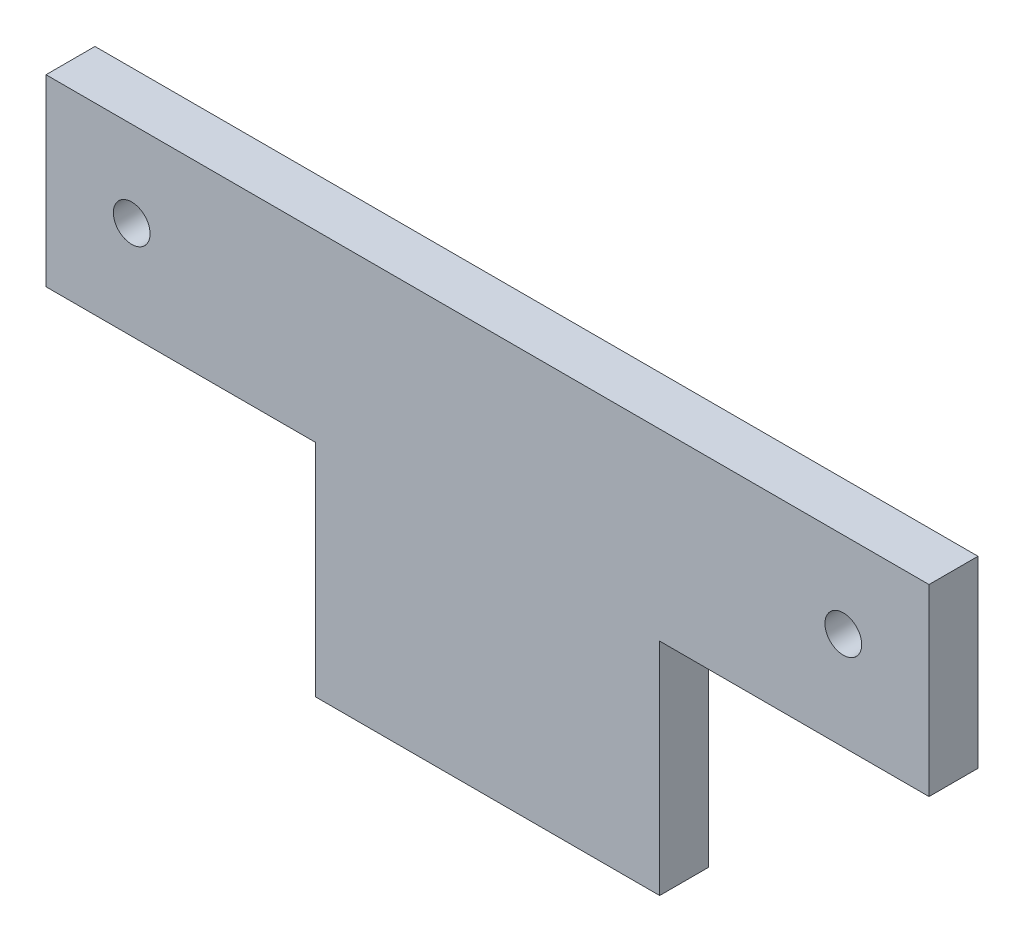
ISO-10303-21;
HEADER;
FILE_DESCRIPTION(('STEP AP214'),'2;1');
FILE_NAME('part.step','',(''),(''),'','','');
FILE_SCHEMA(('AUTOMOTIVE_DESIGN { 1 0 10303 214 1 1 1 1 }'));
ENDSEC;
DATA;
#1=APPLICATION_CONTEXT('core data for automotive mechanical design processes');
#2=APPLICATION_PROTOCOL_DEFINITION('international standard','automotive_design',2000,#1);
#3=PRODUCT_CONTEXT('',#1,'mechanical');
#4=PRODUCT('Part','Part','',(#3));
#5=PRODUCT_RELATED_PRODUCT_CATEGORY('part','',(#4));
#6=PRODUCT_DEFINITION_FORMATION('','',#4);
#7=PRODUCT_DEFINITION_CONTEXT('part definition',#1,'design');
#8=PRODUCT_DEFINITION('design','',#6,#7);
#9=PRODUCT_DEFINITION_SHAPE('','',#8);
#10=(LENGTH_UNIT() NAMED_UNIT(*) SI_UNIT(.MILLI.,.METRE.));
#11=(NAMED_UNIT(*) PLANE_ANGLE_UNIT() SI_UNIT($,.RADIAN.));
#12=(NAMED_UNIT(*) SI_UNIT($,.STERADIAN.) SOLID_ANGLE_UNIT());
#13=UNCERTAINTY_MEASURE_WITH_UNIT(LENGTH_MEASURE(1.E-05),#10,'distance_accuracy_value','');
#14=(GEOMETRIC_REPRESENTATION_CONTEXT(3) GLOBAL_UNCERTAINTY_ASSIGNED_CONTEXT((#13)) GLOBAL_UNIT_ASSIGNED_CONTEXT((#10,
#11,#12)) REPRESENTATION_CONTEXT('',''));
#15=CARTESIAN_POINT('',(0.,0.,0.));
#16=DIRECTION('',(0.,0.,1.));
#17=DIRECTION('',(1.,0.,0.));
#18=AXIS2_PLACEMENT_3D('',#15,#16,#17);
#19=CARTESIAN_POINT('',(0.,0.,4.));
#20=DIRECTION('',(0.,0.,-1.));
#21=DIRECTION('',(-1.,0.,0.));
#22=AXIS2_PLACEMENT_3D('',#19,#20,#21);
#23=PLANE('',#22);
#24=DIRECTION('',(0.,-1.,0.));
#25=VECTOR('',#24,1.);
#26=CARTESIAN_POINT('',(-7.,-8.00000000000001,4.));
#27=LINE('',#26,#25);
#28=CARTESIAN_POINT('',(-7.,7.,4.));
#29=VERTEX_POINT('',#28);
#30=CARTESIAN_POINT('',(-7.,-8.00000000000001,4.));
#31=VERTEX_POINT('',#30);
#32=EDGE_CURVE('E164',#29,#31,#27,.T.);
#33=ORIENTED_EDGE('',*,*,#32,.T.);
#34=DIRECTION('',(1.,0.,0.));
#35=VECTOR('',#34,1.);
#36=CARTESIAN_POINT('',(15.,-8.,4.));
#37=LINE('',#36,#35);
#38=CARTESIAN_POINT('',(15.,-8.,4.));
#39=VERTEX_POINT('',#38);
#40=EDGE_CURVE('E100',#31,#39,#37,.T.);
#41=ORIENTED_EDGE('',*,*,#40,.T.);
#42=DIRECTION('',(0.,-1.,0.));
#43=VECTOR('',#42,1.);
#44=CARTESIAN_POINT('',(15.,-26.,4.));
#45=LINE('',#44,#43);
#46=CARTESIAN_POINT('',(15.,-26.,4.));
#47=VERTEX_POINT('',#46);
#48=EDGE_CURVE('E185',#39,#47,#45,.T.);
#49=ORIENTED_EDGE('',*,*,#48,.T.);
#50=DIRECTION('',(1.,0.,0.));
#51=VECTOR('',#50,1.);
#52=CARTESIAN_POINT('',(43.12,-26.,4.));
#53=LINE('',#52,#51);
#54=CARTESIAN_POINT('',(43.12,-26.,4.));
#55=VERTEX_POINT('',#54);
#56=EDGE_CURVE('E199',#47,#55,#53,.T.);
#57=ORIENTED_EDGE('',*,*,#56,.T.);
#58=DIRECTION('',(0.,1.,0.));
#59=VECTOR('',#58,1.);
#60=CARTESIAN_POINT('',(43.12,-8.,4.));
#61=LINE('',#60,#59);
#62=CARTESIAN_POINT('',(43.12,-8.,4.));
#63=VERTEX_POINT('',#62);
#64=EDGE_CURVE('E119',#55,#63,#61,.T.);
#65=ORIENTED_EDGE('',*,*,#64,.T.);
#66=DIRECTION('',(1.,0.,0.));
#67=VECTOR('',#66,1.);
#68=CARTESIAN_POINT('',(65.12,-8.,4.));
#69=LINE('',#68,#67);
#70=CARTESIAN_POINT('',(65.12,-8.,4.));
#71=VERTEX_POINT('',#70);
#72=EDGE_CURVE('E113',#63,#71,#69,.T.);
#73=ORIENTED_EDGE('',*,*,#72,.T.);
#74=DIRECTION('',(0.,1.,0.));
#75=VECTOR('',#74,1.);
#76=CARTESIAN_POINT('',(65.12,7.,4.));
#77=LINE('',#76,#75);
#78=CARTESIAN_POINT('',(65.12,7.,4.));
#79=VERTEX_POINT('',#78);
#80=EDGE_CURVE('E117',#71,#79,#77,.T.);
#81=ORIENTED_EDGE('',*,*,#80,.T.);
#82=DIRECTION('',(-1.,0.,0.));
#83=VECTOR('',#82,1.);
#84=CARTESIAN_POINT('',(-7.,7.,4.));
#85=LINE('',#84,#83);
#86=EDGE_CURVE('E57',#79,#29,#85,.T.);
#87=ORIENTED_EDGE('',*,*,#86,.T.);
#88=EDGE_LOOP('',(#33,#41,#49,#57,#65,#73,#81,#87));
#89=FACE_BOUND('',#88,.T.);
#90=CARTESIAN_POINT('',(0.,0.,4.));
#91=DIRECTION('',(0.,0.,1.));
#92=DIRECTION('',(1.,0.,0.));
#93=AXIS2_PLACEMENT_3D('',#90,#91,#92);
#94=CIRCLE('',#93,1.5);
#95=CARTESIAN_POINT('',(1.5,0.,4.));
#96=VERTEX_POINT('',#95);
#97=EDGE_CURVE('E146',#96,#96,#94,.T.);
#98=ORIENTED_EDGE('',*,*,#97,.F.);
#99=EDGE_LOOP('',(#98));
#100=FACE_BOUND('',#99,.T.);
#101=CARTESIAN_POINT('',(58.12,0.,4.));
#102=DIRECTION('',(0.,0.,1.));
#103=DIRECTION('',(1.,0.,0.));
#104=AXIS2_PLACEMENT_3D('',#101,#102,#103);
#105=CIRCLE('',#104,1.5);
#106=CARTESIAN_POINT('',(59.62,0.,4.));
#107=VERTEX_POINT('',#106);
#108=EDGE_CURVE('E213',#107,#107,#105,.T.);
#109=ORIENTED_EDGE('',*,*,#108,.F.);
#110=EDGE_LOOP('',(#109));
#111=FACE_BOUND('',#110,.T.);
#112=ADVANCED_FACE('F39',(#89,#100,#111),#23,.F.);
#113=CARTESIAN_POINT('',(0.,0.,0.));
#114=DIRECTION('',(0.,0.,-1.));
#115=DIRECTION('',(-1.,0.,0.));
#116=AXIS2_PLACEMENT_3D('',#113,#114,#115);
#117=PLANE('',#116);
#118=CARTESIAN_POINT('',(0.,0.,0.));
#119=DIRECTION('',(0.,0.,1.));
#120=DIRECTION('',(1.,0.,0.));
#121=AXIS2_PLACEMENT_3D('',#118,#119,#120);
#122=CIRCLE('',#121,1.5);
#123=CARTESIAN_POINT('',(1.5,0.,0.));
#124=VERTEX_POINT('',#123);
#125=EDGE_CURVE('E209',#124,#124,#122,.T.);
#126=ORIENTED_EDGE('',*,*,#125,.T.);
#127=EDGE_LOOP('',(#126));
#128=FACE_BOUND('',#127,.T.);
#129=DIRECTION('',(0.,-1.,0.));
#130=VECTOR('',#129,1.);
#131=CARTESIAN_POINT('',(-7.,-8.00000000000001,0.));
#132=LINE('',#131,#130);
#133=CARTESIAN_POINT('',(-7.,7.,0.));
#134=VERTEX_POINT('',#133);
#135=CARTESIAN_POINT('',(-7.,-8.00000000000001,0.));
#136=VERTEX_POINT('',#135);
#137=EDGE_CURVE('E141',#134,#136,#132,.T.);
#138=ORIENTED_EDGE('',*,*,#137,.F.);
#139=DIRECTION('',(-1.,0.,0.));
#140=VECTOR('',#139,1.);
#141=CARTESIAN_POINT('',(-7.,7.,0.));
#142=LINE('',#141,#140);
#143=CARTESIAN_POINT('',(65.12,7.,0.));
#144=VERTEX_POINT('',#143);
#145=EDGE_CURVE('E92',#144,#134,#142,.T.);
#146=ORIENTED_EDGE('',*,*,#145,.F.);
#147=DIRECTION('',(0.,1.,0.));
#148=VECTOR('',#147,1.);
#149=CARTESIAN_POINT('',(65.12,7.,0.));
#150=LINE('',#149,#148);
#151=CARTESIAN_POINT('',(65.12,-8.,0.));
#152=VERTEX_POINT('',#151);
#153=EDGE_CURVE('E86',#152,#144,#150,.T.);
#154=ORIENTED_EDGE('',*,*,#153,.F.);
#155=DIRECTION('',(1.,0.,0.));
#156=VECTOR('',#155,1.);
#157=CARTESIAN_POINT('',(65.12,-8.,0.));
#158=LINE('',#157,#156);
#159=CARTESIAN_POINT('',(43.12,-8.,0.));
#160=VERTEX_POINT('',#159);
#161=EDGE_CURVE('E128',#160,#152,#158,.T.);
#162=ORIENTED_EDGE('',*,*,#161,.F.);
#163=DIRECTION('',(0.,1.,0.));
#164=VECTOR('',#163,1.);
#165=CARTESIAN_POINT('',(43.12,-8.,0.));
#166=LINE('',#165,#164);
#167=CARTESIAN_POINT('',(43.12,-26.,0.));
#168=VERTEX_POINT('',#167);
#169=EDGE_CURVE('E155',#168,#160,#166,.T.);
#170=ORIENTED_EDGE('',*,*,#169,.F.);
#171=DIRECTION('',(1.,0.,0.));
#172=VECTOR('',#171,1.);
#173=CARTESIAN_POINT('',(43.12,-26.,0.));
#174=LINE('',#173,#172);
#175=CARTESIAN_POINT('',(15.,-26.,0.));
#176=VERTEX_POINT('',#175);
#177=EDGE_CURVE('E152',#176,#168,#174,.T.);
#178=ORIENTED_EDGE('',*,*,#177,.F.);
#179=DIRECTION('',(0.,-1.,0.));
#180=VECTOR('',#179,1.);
#181=CARTESIAN_POINT('',(15.,-26.,0.));
#182=LINE('',#181,#180);
#183=CARTESIAN_POINT('',(15.,-8.,0.));
#184=VERTEX_POINT('',#183);
#185=EDGE_CURVE('E149',#184,#176,#182,.T.);
#186=ORIENTED_EDGE('',*,*,#185,.F.);
#187=DIRECTION('',(1.,0.,0.));
#188=VECTOR('',#187,1.);
#189=CARTESIAN_POINT('',(15.,-8.,0.));
#190=LINE('',#189,#188);
#191=EDGE_CURVE('E145',#136,#184,#190,.T.);
#192=ORIENTED_EDGE('',*,*,#191,.F.);
#193=EDGE_LOOP('',(#138,#146,#154,#162,#170,#178,#186,#192));
#194=FACE_BOUND('',#193,.T.);
#195=CARTESIAN_POINT('',(58.12,0.,0.));
#196=DIRECTION('',(0.,0.,1.));
#197=DIRECTION('',(1.,0.,0.));
#198=AXIS2_PLACEMENT_3D('',#195,#196,#197);
#199=CIRCLE('',#198,1.5);
#200=CARTESIAN_POINT('',(59.62,0.,0.));
#201=VERTEX_POINT('',#200);
#202=EDGE_CURVE('E217',#201,#201,#199,.T.);
#203=ORIENTED_EDGE('',*,*,#202,.T.);
#204=EDGE_LOOP('',(#203));
#205=FACE_BOUND('',#204,.T.);
#206=ADVANCED_FACE('F189',(#128,#194,#205),#117,.T.);
#207=CARTESIAN_POINT('',(-7.,-8.00000000000001,4.));
#208=DIRECTION('',(1.,0.,0.));
#209=DIRECTION('',(0.,1.,0.));
#210=AXIS2_PLACEMENT_3D('',#207,#208,#209);
#211=PLANE('',#210);
#212=ORIENTED_EDGE('',*,*,#137,.T.);
#213=DIRECTION('',(0.,0.,-1.));
#214=VECTOR('',#213,1.);
#215=CARTESIAN_POINT('',(-7.,-8.00000000000001,4.));
#216=LINE('',#215,#214);
#217=EDGE_CURVE('E11',#31,#136,#216,.T.);
#218=ORIENTED_EDGE('',*,*,#217,.F.);
#219=ORIENTED_EDGE('',*,*,#32,.F.);
#220=DIRECTION('',(0.,0.,-1.));
#221=VECTOR('',#220,1.);
#222=CARTESIAN_POINT('',(-7.,7.,4.));
#223=LINE('',#222,#221);
#224=EDGE_CURVE('E137',#29,#134,#223,.T.);
#225=ORIENTED_EDGE('',*,*,#224,.T.);
#226=EDGE_LOOP('',(#212,#218,#219,#225));
#227=FACE_BOUND('',#226,.T.);
#228=ADVANCED_FACE('F41',(#227),#211,.F.);
#229=CARTESIAN_POINT('',(15.,-8.,4.));
#230=DIRECTION('',(0.,1.,0.));
#231=DIRECTION('',(-1.,0.,0.));
#232=AXIS2_PLACEMENT_3D('',#229,#230,#231);
#233=PLANE('',#232);
#234=ORIENTED_EDGE('',*,*,#191,.T.);
#235=DIRECTION('',(0.,0.,-1.));
#236=VECTOR('',#235,1.);
#237=CARTESIAN_POINT('',(15.,-8.,4.));
#238=LINE('',#237,#236);
#239=EDGE_CURVE('E49',#39,#184,#238,.T.);
#240=ORIENTED_EDGE('',*,*,#239,.F.);
#241=ORIENTED_EDGE('',*,*,#40,.F.);
#242=ORIENTED_EDGE('',*,*,#217,.T.);
#243=EDGE_LOOP('',(#234,#240,#241,#242));
#244=FACE_BOUND('',#243,.T.);
#245=ADVANCED_FACE('F251',(#244),#233,.F.);
#246=CARTESIAN_POINT('',(15.,-26.,4.));
#247=DIRECTION('',(1.,0.,0.));
#248=DIRECTION('',(0.,1.,0.));
#249=AXIS2_PLACEMENT_3D('',#246,#247,#248);
#250=PLANE('',#249);
#251=ORIENTED_EDGE('',*,*,#185,.T.);
#252=DIRECTION('',(0.,0.,-1.));
#253=VECTOR('',#252,1.);
#254=CARTESIAN_POINT('',(15.,-26.,4.));
#255=LINE('',#254,#253);
#256=EDGE_CURVE('E175',#47,#176,#255,.T.);
#257=ORIENTED_EDGE('',*,*,#256,.F.);
#258=ORIENTED_EDGE('',*,*,#48,.F.);
#259=ORIENTED_EDGE('',*,*,#239,.T.);
#260=EDGE_LOOP('',(#251,#257,#258,#259));
#261=FACE_BOUND('',#260,.T.);
#262=ADVANCED_FACE('F183',(#261),#250,.F.);
#263=CARTESIAN_POINT('',(43.12,-26.,4.));
#264=DIRECTION('',(0.,1.,0.));
#265=DIRECTION('',(-1.,0.,0.));
#266=AXIS2_PLACEMENT_3D('',#263,#264,#265);
#267=PLANE('',#266);
#268=ORIENTED_EDGE('',*,*,#177,.T.);
#269=DIRECTION('',(0.,0.,-1.));
#270=VECTOR('',#269,1.);
#271=CARTESIAN_POINT('',(43.12,-26.,4.));
#272=LINE('',#271,#270);
#273=EDGE_CURVE('E171',#55,#168,#272,.T.);
#274=ORIENTED_EDGE('',*,*,#273,.F.);
#275=ORIENTED_EDGE('',*,*,#56,.F.);
#276=ORIENTED_EDGE('',*,*,#256,.T.);
#277=EDGE_LOOP('',(#268,#274,#275,#276));
#278=FACE_BOUND('',#277,.T.);
#279=ADVANCED_FACE('F194',(#278),#267,.F.);
#280=CARTESIAN_POINT('',(43.12,-8.,4.));
#281=DIRECTION('',(-1.,0.,0.));
#282=DIRECTION('',(0.,0.,1.));
#283=AXIS2_PLACEMENT_3D('',#280,#281,#282);
#284=PLANE('',#283);
#285=ORIENTED_EDGE('',*,*,#169,.T.);
#286=DIRECTION('',(0.,0.,-1.));
#287=VECTOR('',#286,1.);
#288=CARTESIAN_POINT('',(43.12,-8.,4.));
#289=LINE('',#288,#287);
#290=EDGE_CURVE('E130',#63,#160,#289,.T.);
#291=ORIENTED_EDGE('',*,*,#290,.F.);
#292=ORIENTED_EDGE('',*,*,#64,.F.);
#293=ORIENTED_EDGE('',*,*,#273,.T.);
#294=EDGE_LOOP('',(#285,#291,#292,#293));
#295=FACE_BOUND('',#294,.T.);
#296=ADVANCED_FACE('F197',(#295),#284,.F.);
#297=CARTESIAN_POINT('',(65.12,-8.,4.));
#298=DIRECTION('',(0.,1.,0.));
#299=DIRECTION('',(-1.,0.,0.));
#300=AXIS2_PLACEMENT_3D('',#297,#298,#299);
#301=PLANE('',#300);
#302=ORIENTED_EDGE('',*,*,#161,.T.);
#303=DIRECTION('',(0.,0.,-1.));
#304=VECTOR('',#303,1.);
#305=CARTESIAN_POINT('',(65.12,-8.,4.));
#306=LINE('',#305,#304);
#307=EDGE_CURVE('E125',#71,#152,#306,.T.);
#308=ORIENTED_EDGE('',*,*,#307,.F.);
#309=ORIENTED_EDGE('',*,*,#72,.F.);
#310=ORIENTED_EDGE('',*,*,#290,.T.);
#311=EDGE_LOOP('',(#302,#308,#309,#310));
#312=FACE_BOUND('',#311,.T.);
#313=ADVANCED_FACE('F126',(#312),#301,.F.);
#314=CARTESIAN_POINT('',(65.12,7.,4.));
#315=DIRECTION('',(-1.,0.,0.));
#316=DIRECTION('',(0.,0.,1.));
#317=AXIS2_PLACEMENT_3D('',#314,#315,#316);
#318=PLANE('',#317);
#319=ORIENTED_EDGE('',*,*,#153,.T.);
#320=DIRECTION('',(0.,0.,-1.));
#321=VECTOR('',#320,1.);
#322=CARTESIAN_POINT('',(65.12,7.,4.));
#323=LINE('',#322,#321);
#324=EDGE_CURVE('E131',#79,#144,#323,.T.);
#325=ORIENTED_EDGE('',*,*,#324,.F.);
#326=ORIENTED_EDGE('',*,*,#80,.F.);
#327=ORIENTED_EDGE('',*,*,#307,.T.);
#328=EDGE_LOOP('',(#319,#325,#326,#327));
#329=FACE_BOUND('',#328,.T.);
#330=ADVANCED_FACE('F133',(#329),#318,.F.);
#331=CARTESIAN_POINT('',(-7.,7.,4.));
#332=DIRECTION('',(0.,-1.,0.));
#333=DIRECTION('',(0.,0.,-1.));
#334=AXIS2_PLACEMENT_3D('',#331,#332,#333);
#335=PLANE('',#334);
#336=ORIENTED_EDGE('',*,*,#145,.T.);
#337=ORIENTED_EDGE('',*,*,#224,.F.);
#338=ORIENTED_EDGE('',*,*,#86,.F.);
#339=ORIENTED_EDGE('',*,*,#324,.T.);
#340=EDGE_LOOP('',(#336,#337,#338,#339));
#341=FACE_BOUND('',#340,.T.);
#342=ADVANCED_FACE('F239',(#341),#335,.F.);
#343=CARTESIAN_POINT('',(0.,0.,4.));
#344=DIRECTION('',(0.,0.,-1.));
#345=DIRECTION('',(-1.,0.,0.));
#346=AXIS2_PLACEMENT_3D('',#343,#344,#345);
#347=CYLINDRICAL_SURFACE('',#346,1.5);
#348=ORIENTED_EDGE('',*,*,#97,.T.);
#349=EDGE_LOOP('',(#348));
#350=FACE_BOUND('',#349,.T.);
#351=ORIENTED_EDGE('',*,*,#125,.F.);
#352=EDGE_LOOP('',(#351));
#353=FACE_BOUND('',#352,.T.);
#354=ADVANCED_FACE('F236',(#350,#353),#347,.F.);
#355=CARTESIAN_POINT('',(58.12,0.,4.));
#356=DIRECTION('',(0.,0.,-1.));
#357=DIRECTION('',(-1.,0.,0.));
#358=AXIS2_PLACEMENT_3D('',#355,#356,#357);
#359=CYLINDRICAL_SURFACE('',#358,1.5);
#360=ORIENTED_EDGE('',*,*,#108,.T.);
#361=EDGE_LOOP('',(#360));
#362=FACE_BOUND('',#361,.T.);
#363=ORIENTED_EDGE('',*,*,#202,.F.);
#364=EDGE_LOOP('',(#363));
#365=FACE_BOUND('',#364,.T.);
#366=ADVANCED_FACE('F225',(#362,#365),#359,.F.);
#367=CLOSED_SHELL('',(#112,#206,#228,#245,#262,#279,#296,#313,#330,#342,#354,#366));
#368=MANIFOLD_SOLID_BREP('B2',#367);
#369=ADVANCED_BREP_SHAPE_REPRESENTATION('',(#18,#368),#14);
#370=SHAPE_DEFINITION_REPRESENTATION(#9,#369);
ENDSEC;
END-ISO-10303-21;
